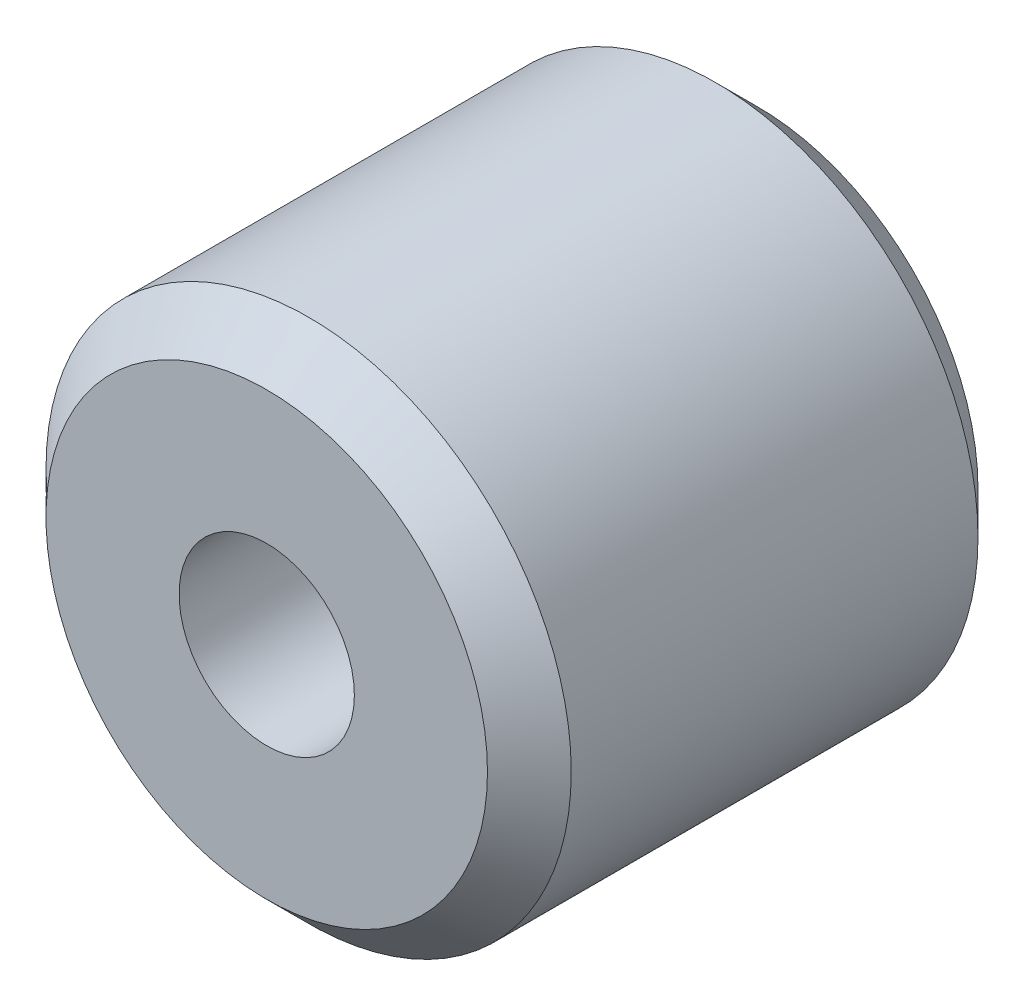
ISO-10303-21;
HEADER;
FILE_DESCRIPTION(('STEP AP214'),'2;1');
FILE_NAME('part.step','',(''),(''),'','','');
FILE_SCHEMA(('AUTOMOTIVE_DESIGN { 1 0 10303 214 1 1 1 1 }'));
ENDSEC;
DATA;
#1=APPLICATION_CONTEXT('core data for automotive mechanical design processes');
#2=APPLICATION_PROTOCOL_DEFINITION('international standard','automotive_design',2000,#1);
#3=PRODUCT_CONTEXT('',#1,'mechanical');
#4=PRODUCT('Part','Part','',(#3));
#5=PRODUCT_RELATED_PRODUCT_CATEGORY('part','',(#4));
#6=PRODUCT_DEFINITION_FORMATION('','',#4);
#7=PRODUCT_DEFINITION_CONTEXT('part definition',#1,'design');
#8=PRODUCT_DEFINITION('design','',#6,#7);
#9=PRODUCT_DEFINITION_SHAPE('','',#8);
#10=(LENGTH_UNIT() NAMED_UNIT(*) SI_UNIT(.MILLI.,.METRE.));
#11=(NAMED_UNIT(*) PLANE_ANGLE_UNIT() SI_UNIT($,.RADIAN.));
#12=(NAMED_UNIT(*) SI_UNIT($,.STERADIAN.) SOLID_ANGLE_UNIT());
#13=UNCERTAINTY_MEASURE_WITH_UNIT(LENGTH_MEASURE(1.E-05),#10,'distance_accuracy_value','');
#14=(GEOMETRIC_REPRESENTATION_CONTEXT(3) GLOBAL_UNCERTAINTY_ASSIGNED_CONTEXT((#13)) GLOBAL_UNIT_ASSIGNED_CONTEXT((#10,
#11,#12)) REPRESENTATION_CONTEXT('',''));
#15=CARTESIAN_POINT('',(0.,0.,0.));
#16=DIRECTION('',(0.,0.,1.));
#17=DIRECTION('',(1.,0.,0.));
#18=AXIS2_PLACEMENT_3D('',#15,#16,#17);
#19=CARTESIAN_POINT('',(0.,0.,4.45));
#20=DIRECTION('',(0.,0.,1.));
#21=DIRECTION('',(1.,0.,0.));
#22=AXIS2_PLACEMENT_3D('',#19,#20,#21);
#23=PLANE('',#22);
#24=CARTESIAN_POINT('',(0.,0.,4.45));
#25=DIRECTION('',(0.,0.,1.));
#26=DIRECTION('',(1.,0.,0.));
#27=AXIS2_PLACEMENT_3D('',#24,#25,#26);
#28=CIRCLE('',#27,4.005);
#29=CARTESIAN_POINT('',(4.005,0.,4.45));
#30=VERTEX_POINT('',#29);
#31=EDGE_CURVE('E10',#30,#30,#28,.T.);
#32=ORIENTED_EDGE('',*,*,#31,.T.);
#33=EDGE_LOOP('',(#32));
#34=FACE_BOUND('',#33,.T.);
#35=CARTESIAN_POINT('',(0.,0.,4.45));
#36=DIRECTION('',(0.,0.,1.));
#37=DIRECTION('',(1.,0.,0.));
#38=AXIS2_PLACEMENT_3D('',#35,#36,#37);
#39=CIRCLE('',#38,1.59);
#40=CARTESIAN_POINT('',(1.59,0.,4.45));
#41=VERTEX_POINT('',#40);
#42=EDGE_CURVE('E64',#41,#41,#39,.T.);
#43=ORIENTED_EDGE('',*,*,#42,.F.);
#44=EDGE_LOOP('',(#43));
#45=FACE_BOUND('',#44,.T.);
#46=ADVANCED_FACE('F39',(#34,#45),#23,.T.);
#47=CARTESIAN_POINT('',(0.,0.,-4.45));
#48=DIRECTION('',(0.,0.,1.));
#49=DIRECTION('',(1.,0.,0.));
#50=AXIS2_PLACEMENT_3D('',#47,#48,#49);
#51=PLANE('',#50);
#52=CARTESIAN_POINT('',(0.,0.,-4.45));
#53=DIRECTION('',(0.,0.,1.));
#54=DIRECTION('',(1.,0.,0.));
#55=AXIS2_PLACEMENT_3D('',#52,#53,#54);
#56=CIRCLE('',#55,4.00499999999999);
#57=CARTESIAN_POINT('',(4.00499999999999,0.,-4.45));
#58=VERTEX_POINT('',#57);
#59=EDGE_CURVE('E48',#58,#58,#56,.F.);
#60=ORIENTED_EDGE('',*,*,#59,.T.);
#61=EDGE_LOOP('',(#60));
#62=FACE_BOUND('',#61,.T.);
#63=CARTESIAN_POINT('',(0.,0.,-4.45));
#64=DIRECTION('',(0.,0.,1.));
#65=DIRECTION('',(1.,0.,0.));
#66=AXIS2_PLACEMENT_3D('',#63,#64,#65);
#67=CIRCLE('',#66,1.59);
#68=CARTESIAN_POINT('',(1.59,0.,-4.45));
#69=VERTEX_POINT('',#68);
#70=EDGE_CURVE('E65',#69,#69,#67,.T.);
#71=ORIENTED_EDGE('',*,*,#70,.T.);
#72=EDGE_LOOP('',(#71));
#73=FACE_BOUND('',#72,.T.);
#74=ADVANCED_FACE('F77',(#62,#73),#51,.F.);
#75=CARTESIAN_POINT('',(0.,0.,4.45));
#76=DIRECTION('',(0.,0.,-1.));
#77=DIRECTION('',(-1.,0.,0.));
#78=AXIS2_PLACEMENT_3D('',#75,#76,#77);
#79=CYLINDRICAL_SURFACE('',#78,4.765);
#80=CARTESIAN_POINT('',(0.,0.,-3.69));
#81=DIRECTION('',(0.,0.,1.));
#82=DIRECTION('',(1.,0.,0.));
#83=AXIS2_PLACEMENT_3D('',#80,#81,#82);
#84=CIRCLE('',#83,4.765);
#85=CARTESIAN_POINT('',(4.765,0.,-3.69));
#86=VERTEX_POINT('',#85);
#87=EDGE_CURVE('E53',#86,#86,#84,.T.);
#88=ORIENTED_EDGE('',*,*,#87,.T.);
#89=EDGE_LOOP('',(#88));
#90=FACE_BOUND('',#89,.T.);
#91=CARTESIAN_POINT('',(0.,0.,3.69));
#92=DIRECTION('',(0.,0.,1.));
#93=DIRECTION('',(1.,0.,0.));
#94=AXIS2_PLACEMENT_3D('',#91,#92,#93);
#95=CIRCLE('',#94,4.765);
#96=CARTESIAN_POINT('',(4.765,0.,3.69));
#97=VERTEX_POINT('',#96);
#98=EDGE_CURVE('E58',#97,#97,#95,.F.);
#99=ORIENTED_EDGE('',*,*,#98,.T.);
#100=EDGE_LOOP('',(#99));
#101=FACE_BOUND('',#100,.T.);
#102=ADVANCED_FACE('F82',(#90,#101),#79,.T.);
#103=CARTESIAN_POINT('',(0.,0.,4.45));
#104=DIRECTION('',(0.,0.,-1.));
#105=DIRECTION('',(-1.,0.,0.));
#106=AXIS2_PLACEMENT_3D('',#103,#104,#105);
#107=CYLINDRICAL_SURFACE('',#106,1.59);
#108=ORIENTED_EDGE('',*,*,#42,.T.);
#109=EDGE_LOOP('',(#108));
#110=FACE_BOUND('',#109,.T.);
#111=ORIENTED_EDGE('',*,*,#70,.F.);
#112=EDGE_LOOP('',(#111));
#113=FACE_BOUND('',#112,.T.);
#114=ADVANCED_FACE('F73',(#110,#113),#107,.F.);
#115=CARTESIAN_POINT('',(0.,0.,-3.69));
#116=DIRECTION('',(0.,0.,1.));
#117=DIRECTION('',(1.,0.,0.));
#118=AXIS2_PLACEMENT_3D('',#115,#116,#117);
#119=CONICAL_SURFACE('',#118,4.765,0.78539816339745);
#120=ORIENTED_EDGE('',*,*,#59,.F.);
#121=EDGE_LOOP('',(#120));
#122=FACE_BOUND('',#121,.T.);
#123=ORIENTED_EDGE('',*,*,#87,.F.);
#124=EDGE_LOOP('',(#123));
#125=FACE_BOUND('',#124,.T.);
#126=ADVANCED_FACE('F89',(#122,#125),#119,.T.);
#127=CARTESIAN_POINT('',(0.,0.,4.45));
#128=DIRECTION('',(0.,0.,-1.));
#129=DIRECTION('',(-1.,0.,0.));
#130=AXIS2_PLACEMENT_3D('',#127,#128,#129);
#131=CONICAL_SURFACE('',#130,4.005,0.785398163397447);
#132=ORIENTED_EDGE('',*,*,#98,.F.);
#133=EDGE_LOOP('',(#132));
#134=FACE_BOUND('',#133,.T.);
#135=ORIENTED_EDGE('',*,*,#31,.F.);
#136=EDGE_LOOP('',(#135));
#137=FACE_BOUND('',#136,.T.);
#138=ADVANCED_FACE('F42',(#134,#137),#131,.T.);
#139=CLOSED_SHELL('',(#46,#74,#102,#114,#126,#138));
#140=MANIFOLD_SOLID_BREP('B2',#139);
#141=ADVANCED_BREP_SHAPE_REPRESENTATION('',(#18,#140),#14);
#142=SHAPE_DEFINITION_REPRESENTATION(#9,#141);
ENDSEC;
END-ISO-10303-21;
